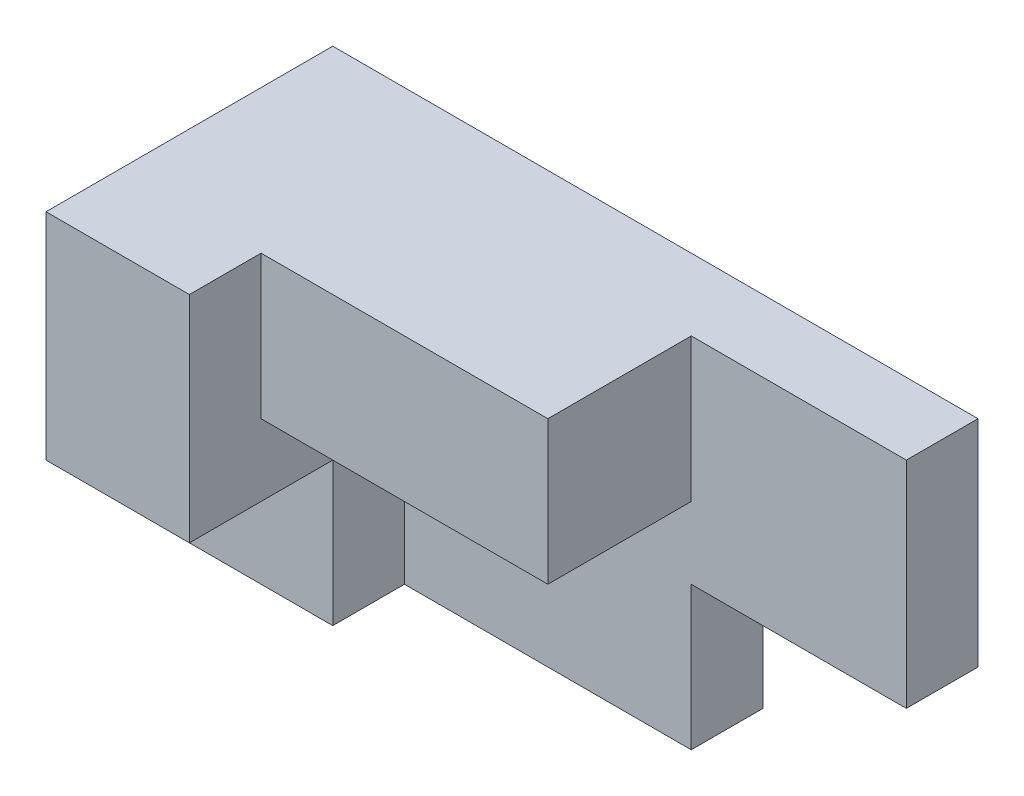
ISO-10303-21;
HEADER;
FILE_DESCRIPTION(('STEP AP214'),'2;1');
FILE_NAME('part.step','',(''),(''),'','','');
FILE_SCHEMA(('AUTOMOTIVE_DESIGN { 1 0 10303 214 1 1 1 1 }'));
ENDSEC;
DATA;
#1=APPLICATION_CONTEXT('core data for automotive mechanical design processes');
#2=APPLICATION_PROTOCOL_DEFINITION('international standard','automotive_design',2000,#1);
#3=PRODUCT_CONTEXT('',#1,'mechanical');
#4=PRODUCT('Part','Part','',(#3));
#5=PRODUCT_RELATED_PRODUCT_CATEGORY('part','',(#4));
#6=PRODUCT_DEFINITION_FORMATION('','',#4);
#7=PRODUCT_DEFINITION_CONTEXT('part definition',#1,'design');
#8=PRODUCT_DEFINITION('design','',#6,#7);
#9=PRODUCT_DEFINITION_SHAPE('','',#8);
#10=(LENGTH_UNIT() NAMED_UNIT(*) SI_UNIT(.MILLI.,.METRE.));
#11=(NAMED_UNIT(*) PLANE_ANGLE_UNIT() SI_UNIT($,.RADIAN.));
#12=(NAMED_UNIT(*) SI_UNIT($,.STERADIAN.) SOLID_ANGLE_UNIT());
#13=UNCERTAINTY_MEASURE_WITH_UNIT(LENGTH_MEASURE(1.E-05),#10,'distance_accuracy_value','');
#14=(GEOMETRIC_REPRESENTATION_CONTEXT(3) GLOBAL_UNCERTAINTY_ASSIGNED_CONTEXT((#13)) GLOBAL_UNIT_ASSIGNED_CONTEXT((#10,
#11,#12)) REPRESENTATION_CONTEXT('',''));
#15=CARTESIAN_POINT('',(0.,0.,0.));
#16=DIRECTION('',(0.,0.,1.));
#17=DIRECTION('',(1.,0.,0.));
#18=AXIS2_PLACEMENT_3D('',#15,#16,#17);
#19=CARTESIAN_POINT('',(0.,0.,10.));
#20=DIRECTION('',(0.,0.,1.));
#21=DIRECTION('',(1.,0.,0.));
#22=AXIS2_PLACEMENT_3D('',#19,#20,#21);
#23=PLANE('',#22);
#24=DIRECTION('',(-1.,0.,0.));
#25=VECTOR('',#24,1.);
#26=CARTESIAN_POINT('',(0.,30.,10.));
#27=LINE('',#26,#25);
#28=CARTESIAN_POINT('',(60.,30.,10.));
#29=VERTEX_POINT('',#28);
#30=CARTESIAN_POINT('',(20.,30.,10.));
#31=VERTEX_POINT('',#30);
#32=EDGE_CURVE('E195',#29,#31,#27,.T.);
#33=ORIENTED_EDGE('',*,*,#32,.T.);
#34=DIRECTION('',(0.,-1.,0.));
#35=VECTOR('',#34,1.);
#36=CARTESIAN_POINT('',(20.,0.,10.));
#37=LINE('',#36,#35);
#38=CARTESIAN_POINT('',(20.,0.,10.));
#39=VERTEX_POINT('',#38);
#40=EDGE_CURVE('E208',#31,#39,#37,.T.);
#41=ORIENTED_EDGE('',*,*,#40,.T.);
#42=DIRECTION('',(1.,0.,0.));
#43=VECTOR('',#42,1.);
#44=CARTESIAN_POINT('',(0.,0.,10.));
#45=LINE('',#44,#43);
#46=CARTESIAN_POINT('',(60.,0.,10.));
#47=VERTEX_POINT('',#46);
#48=EDGE_CURVE('E95',#39,#47,#45,.T.);
#49=ORIENTED_EDGE('',*,*,#48,.T.);
#50=DIRECTION('',(0.,1.,0.));
#51=VECTOR('',#50,1.);
#52=CARTESIAN_POINT('',(60.,0.,10.));
#53=LINE('',#52,#51);
#54=CARTESIAN_POINT('',(60.,20.,10.));
#55=VERTEX_POINT('',#54);
#56=EDGE_CURVE('E213',#47,#55,#53,.T.);
#57=ORIENTED_EDGE('',*,*,#56,.T.);
#58=DIRECTION('',(1.,0.,0.));
#59=VECTOR('',#58,1.);
#60=CARTESIAN_POINT('',(0.,20.,10.));
#61=LINE('',#60,#59);
#62=CARTESIAN_POINT('',(90.,20.,10.));
#63=VERTEX_POINT('',#62);
#64=EDGE_CURVE('E215',#55,#63,#61,.T.);
#65=ORIENTED_EDGE('',*,*,#64,.T.);
#66=DIRECTION('',(0.,-1.,0.));
#67=VECTOR('',#66,1.);
#68=CARTESIAN_POINT('',(90.,0.,10.));
#69=LINE('',#68,#67);
#70=CARTESIAN_POINT('',(90.,50.,10.));
#71=VERTEX_POINT('',#70);
#72=EDGE_CURVE('E217',#71,#63,#69,.T.);
#73=ORIENTED_EDGE('',*,*,#72,.F.);
#74=DIRECTION('',(1.,0.,0.));
#75=VECTOR('',#74,1.);
#76=CARTESIAN_POINT('',(0.,50.,10.));
#77=LINE('',#76,#75);
#78=CARTESIAN_POINT('',(60.,50.,10.));
#79=VERTEX_POINT('',#78);
#80=EDGE_CURVE('E60',#79,#71,#77,.T.);
#81=ORIENTED_EDGE('',*,*,#80,.F.);
#82=DIRECTION('',(0.,-1.,0.));
#83=VECTOR('',#82,1.);
#84=CARTESIAN_POINT('',(60.,0.,10.));
#85=LINE('',#84,#83);
#86=EDGE_CURVE('E192',#79,#29,#85,.T.);
#87=ORIENTED_EDGE('',*,*,#86,.T.);
#88=EDGE_LOOP('',(#33,#41,#49,#57,#65,#73,#81,#87));
#89=FACE_BOUND('',#88,.T.);
#90=ADVANCED_FACE('F39',(#89),#23,.T.);
#91=CARTESIAN_POINT('',(0.,50.,10.));
#92=DIRECTION('',(0.,1.,0.));
#93=DIRECTION('',(-1.,0.,0.));
#94=AXIS2_PLACEMENT_3D('',#91,#92,#93);
#95=PLANE('',#94);
#96=DIRECTION('',(0.,0.,-1.));
#97=VECTOR('',#96,1.);
#98=CARTESIAN_POINT('',(0.,50.,10.));
#99=LINE('',#98,#97);
#100=CARTESIAN_POINT('',(0.,50.,40.));
#101=VERTEX_POINT('',#100);
#102=CARTESIAN_POINT('',(0.,50.,0.));
#103=VERTEX_POINT('',#102);
#104=EDGE_CURVE('E11',#101,#103,#99,.T.);
#105=ORIENTED_EDGE('',*,*,#104,.F.);
#106=DIRECTION('',(1.,0.,0.));
#107=VECTOR('',#106,1.);
#108=CARTESIAN_POINT('',(0.,50.,40.));
#109=LINE('',#108,#107);
#110=CARTESIAN_POINT('',(20.,50.,40.));
#111=VERTEX_POINT('',#110);
#112=EDGE_CURVE('E168',#101,#111,#109,.T.);
#113=ORIENTED_EDGE('',*,*,#112,.T.);
#114=DIRECTION('',(0.,0.,-1.));
#115=VECTOR('',#114,1.);
#116=CARTESIAN_POINT('',(20.,50.,40.));
#117=LINE('',#116,#115);
#118=CARTESIAN_POINT('',(20.,50.,30.));
#119=VERTEX_POINT('',#118);
#120=EDGE_CURVE('E173',#111,#119,#117,.T.);
#121=ORIENTED_EDGE('',*,*,#120,.T.);
#122=DIRECTION('',(1.,0.,0.));
#123=VECTOR('',#122,1.);
#124=CARTESIAN_POINT('',(0.,50.,30.));
#125=LINE('',#124,#123);
#126=CARTESIAN_POINT('',(60.,50.,30.));
#127=VERTEX_POINT('',#126);
#128=EDGE_CURVE('E183',#119,#127,#125,.T.);
#129=ORIENTED_EDGE('',*,*,#128,.T.);
#130=DIRECTION('',(0.,0.,-1.));
#131=VECTOR('',#130,1.);
#132=CARTESIAN_POINT('',(60.,50.,30.));
#133=LINE('',#132,#131);
#134=EDGE_CURVE('E54',#127,#79,#133,.T.);
#135=ORIENTED_EDGE('',*,*,#134,.T.);
#136=ORIENTED_EDGE('',*,*,#80,.T.);
#137=DIRECTION('',(0.,0.,-1.));
#138=VECTOR('',#137,1.);
#139=CARTESIAN_POINT('',(90.,50.,10.));
#140=LINE('',#139,#138);
#141=CARTESIAN_POINT('',(90.,50.,0.));
#142=VERTEX_POINT('',#141);
#143=EDGE_CURVE('E220',#71,#142,#140,.T.);
#144=ORIENTED_EDGE('',*,*,#143,.T.);
#145=DIRECTION('',(1.,0.,0.));
#146=VECTOR('',#145,1.);
#147=CARTESIAN_POINT('',(0.,50.,0.));
#148=LINE('',#147,#146);
#149=EDGE_CURVE('E88',#103,#142,#148,.T.);
#150=ORIENTED_EDGE('',*,*,#149,.F.);
#151=EDGE_LOOP('',(#105,#113,#121,#129,#135,#136,#144,#150));
#152=FACE_BOUND('',#151,.T.);
#153=ADVANCED_FACE('F41',(#152),#95,.T.);
#154=CARTESIAN_POINT('',(0.,0.,10.));
#155=DIRECTION('',(-1.,0.,0.));
#156=DIRECTION('',(0.,0.,1.));
#157=AXIS2_PLACEMENT_3D('',#154,#155,#156);
#158=PLANE('',#157);
#159=DIRECTION('',(0.,1.,0.));
#160=VECTOR('',#159,1.);
#161=CARTESIAN_POINT('',(0.,0.,40.));
#162=LINE('',#161,#160);
#163=CARTESIAN_POINT('',(0.,20.,40.));
#164=VERTEX_POINT('',#163);
#165=EDGE_CURVE('E149',#164,#101,#162,.T.);
#166=ORIENTED_EDGE('',*,*,#165,.T.);
#167=ORIENTED_EDGE('',*,*,#104,.T.);
#168=DIRECTION('',(0.,1.,0.));
#169=VECTOR('',#168,1.);
#170=CARTESIAN_POINT('',(0.,0.,0.));
#171=LINE('',#170,#169);
#172=CARTESIAN_POINT('',(0.,0.,0.));
#173=VERTEX_POINT('',#172);
#174=EDGE_CURVE('E222',#173,#103,#171,.T.);
#175=ORIENTED_EDGE('',*,*,#174,.F.);
#176=DIRECTION('',(0.,0.,-1.));
#177=VECTOR('',#176,1.);
#178=CARTESIAN_POINT('',(0.,0.,10.));
#179=LINE('',#178,#177);
#180=CARTESIAN_POINT('',(0.,0.,20.));
#181=VERTEX_POINT('',#180);
#182=EDGE_CURVE('E47',#181,#173,#179,.T.);
#183=ORIENTED_EDGE('',*,*,#182,.F.);
#184=DIRECTION('',(0.,1.,0.));
#185=VECTOR('',#184,1.);
#186=CARTESIAN_POINT('',(0.,0.,20.));
#187=LINE('',#186,#185);
#188=CARTESIAN_POINT('',(0.,20.,20.));
#189=VERTEX_POINT('',#188);
#190=EDGE_CURVE('E152',#181,#189,#187,.T.);
#191=ORIENTED_EDGE('',*,*,#190,.T.);
#192=DIRECTION('',(0.,0.,-1.));
#193=VECTOR('',#192,1.);
#194=CARTESIAN_POINT('',(0.,20.,40.));
#195=LINE('',#194,#193);
#196=EDGE_CURVE('E145',#164,#189,#195,.T.);
#197=ORIENTED_EDGE('',*,*,#196,.F.);
#198=EDGE_LOOP('',(#166,#167,#175,#183,#191,#197));
#199=FACE_BOUND('',#198,.T.);
#200=ADVANCED_FACE('F147',(#199),#158,.T.);
#201=CARTESIAN_POINT('',(0.,0.,10.));
#202=DIRECTION('',(0.,1.,0.));
#203=DIRECTION('',(0.,0.,1.));
#204=AXIS2_PLACEMENT_3D('',#201,#202,#203);
#205=PLANE('',#204);
#206=DIRECTION('',(1.,0.,0.));
#207=VECTOR('',#206,1.);
#208=CARTESIAN_POINT('',(0.,0.,0.));
#209=LINE('',#208,#207);
#210=CARTESIAN_POINT('',(60.,0.,0.));
#211=VERTEX_POINT('',#210);
#212=EDGE_CURVE('E224',#173,#211,#209,.T.);
#213=ORIENTED_EDGE('',*,*,#212,.T.);
#214=DIRECTION('',(0.,0.,-1.));
#215=VECTOR('',#214,1.);
#216=CARTESIAN_POINT('',(60.,0.,10.));
#217=LINE('',#216,#215);
#218=EDGE_CURVE('E238',#47,#211,#217,.T.);
#219=ORIENTED_EDGE('',*,*,#218,.F.);
#220=ORIENTED_EDGE('',*,*,#48,.F.);
#221=DIRECTION('',(0.,0.,-1.));
#222=VECTOR('',#221,1.);
#223=CARTESIAN_POINT('',(20.,0.,20.));
#224=LINE('',#223,#222);
#225=CARTESIAN_POINT('',(20.,0.,20.));
#226=VERTEX_POINT('',#225);
#227=EDGE_CURVE('E206',#226,#39,#224,.T.);
#228=ORIENTED_EDGE('',*,*,#227,.F.);
#229=DIRECTION('',(1.,0.,0.));
#230=VECTOR('',#229,1.);
#231=CARTESIAN_POINT('',(0.,0.,20.));
#232=LINE('',#231,#230);
#233=EDGE_CURVE('E198',#181,#226,#232,.T.);
#234=ORIENTED_EDGE('',*,*,#233,.F.);
#235=ORIENTED_EDGE('',*,*,#182,.T.);
#236=EDGE_LOOP('',(#213,#219,#220,#228,#234,#235));
#237=FACE_BOUND('',#236,.T.);
#238=ADVANCED_FACE('F243',(#237),#205,.F.);
#239=CARTESIAN_POINT('',(60.,0.,10.));
#240=DIRECTION('',(-1.,0.,0.));
#241=DIRECTION('',(0.,0.,1.));
#242=AXIS2_PLACEMENT_3D('',#239,#240,#241);
#243=PLANE('',#242);
#244=DIRECTION('',(0.,1.,0.));
#245=VECTOR('',#244,1.);
#246=CARTESIAN_POINT('',(60.,0.,0.));
#247=LINE('',#246,#245);
#248=CARTESIAN_POINT('',(60.,20.,0.));
#249=VERTEX_POINT('',#248);
#250=EDGE_CURVE('E226',#211,#249,#247,.T.);
#251=ORIENTED_EDGE('',*,*,#250,.T.);
#252=DIRECTION('',(0.,0.,-1.));
#253=VECTOR('',#252,1.);
#254=CARTESIAN_POINT('',(60.,20.,10.));
#255=LINE('',#254,#253);
#256=EDGE_CURVE('E235',#55,#249,#255,.T.);
#257=ORIENTED_EDGE('',*,*,#256,.F.);
#258=ORIENTED_EDGE('',*,*,#56,.F.);
#259=ORIENTED_EDGE('',*,*,#218,.T.);
#260=EDGE_LOOP('',(#251,#257,#258,#259));
#261=FACE_BOUND('',#260,.T.);
#262=ADVANCED_FACE('F260',(#261),#243,.F.);
#263=CARTESIAN_POINT('',(0.,20.,10.));
#264=DIRECTION('',(0.,1.,0.));
#265=DIRECTION('',(0.,0.,1.));
#266=AXIS2_PLACEMENT_3D('',#263,#264,#265);
#267=PLANE('',#266);
#268=DIRECTION('',(1.,0.,0.));
#269=VECTOR('',#268,1.);
#270=CARTESIAN_POINT('',(0.,20.,0.));
#271=LINE('',#270,#269);
#272=CARTESIAN_POINT('',(90.,20.,0.));
#273=VERTEX_POINT('',#272);
#274=EDGE_CURVE('E228',#249,#273,#271,.T.);
#275=ORIENTED_EDGE('',*,*,#274,.T.);
#276=DIRECTION('',(0.,0.,-1.));
#277=VECTOR('',#276,1.);
#278=CARTESIAN_POINT('',(90.,20.,10.));
#279=LINE('',#278,#277);
#280=EDGE_CURVE('E233',#63,#273,#279,.T.);
#281=ORIENTED_EDGE('',*,*,#280,.F.);
#282=ORIENTED_EDGE('',*,*,#64,.F.);
#283=ORIENTED_EDGE('',*,*,#256,.T.);
#284=EDGE_LOOP('',(#275,#281,#282,#283));
#285=FACE_BOUND('',#284,.T.);
#286=ADVANCED_FACE('F255',(#285),#267,.F.);
#287=CARTESIAN_POINT('',(90.,0.,10.));
#288=DIRECTION('',(1.,0.,0.));
#289=DIRECTION('',(0.,0.,-1.));
#290=AXIS2_PLACEMENT_3D('',#287,#288,#289);
#291=PLANE('',#290);
#292=DIRECTION('',(0.,-1.,0.));
#293=VECTOR('',#292,1.);
#294=CARTESIAN_POINT('',(90.,0.,0.));
#295=LINE('',#294,#293);
#296=EDGE_CURVE('E211',#142,#273,#295,.T.);
#297=ORIENTED_EDGE('',*,*,#296,.F.);
#298=ORIENTED_EDGE('',*,*,#143,.F.);
#299=ORIENTED_EDGE('',*,*,#72,.T.);
#300=ORIENTED_EDGE('',*,*,#280,.T.);
#301=EDGE_LOOP('',(#297,#298,#299,#300));
#302=FACE_BOUND('',#301,.T.);
#303=ADVANCED_FACE('F252',(#302),#291,.T.);
#304=CARTESIAN_POINT('',(0.,0.,0.));
#305=DIRECTION('',(0.,0.,1.));
#306=DIRECTION('',(1.,0.,0.));
#307=AXIS2_PLACEMENT_3D('',#304,#305,#306);
#308=PLANE('',#307);
#309=ORIENTED_EDGE('',*,*,#174,.T.);
#310=ORIENTED_EDGE('',*,*,#149,.T.);
#311=ORIENTED_EDGE('',*,*,#296,.T.);
#312=ORIENTED_EDGE('',*,*,#274,.F.);
#313=ORIENTED_EDGE('',*,*,#250,.F.);
#314=ORIENTED_EDGE('',*,*,#212,.F.);
#315=EDGE_LOOP('',(#309,#310,#311,#312,#313,#314));
#316=FACE_BOUND('',#315,.T.);
#317=ADVANCED_FACE('F247',(#316),#308,.F.);
#318=CARTESIAN_POINT('',(20.,0.,20.));
#319=DIRECTION('',(-1.,0.,0.));
#320=DIRECTION('',(0.,-1.,0.));
#321=AXIS2_PLACEMENT_3D('',#318,#319,#320);
#322=PLANE('',#321);
#323=ORIENTED_EDGE('',*,*,#40,.F.);
#324=DIRECTION('',(0.,0.,-1.));
#325=VECTOR('',#324,1.);
#326=CARTESIAN_POINT('',(20.,30.,30.));
#327=LINE('',#326,#325);
#328=CARTESIAN_POINT('',(20.,30.,30.));
#329=VERTEX_POINT('',#328);
#330=EDGE_CURVE('E189',#329,#31,#327,.T.);
#331=ORIENTED_EDGE('',*,*,#330,.F.);
#332=DIRECTION('',(0.,1.,0.));
#333=VECTOR('',#332,1.);
#334=CARTESIAN_POINT('',(20.,0.,30.));
#335=LINE('',#334,#333);
#336=EDGE_CURVE('E155',#329,#119,#335,.T.);
#337=ORIENTED_EDGE('',*,*,#336,.T.);
#338=ORIENTED_EDGE('',*,*,#120,.F.);
#339=DIRECTION('',(0.,1.,0.));
#340=VECTOR('',#339,1.);
#341=CARTESIAN_POINT('',(20.,0.,40.));
#342=LINE('',#341,#340);
#343=CARTESIAN_POINT('',(20.,20.,40.));
#344=VERTEX_POINT('',#343);
#345=EDGE_CURVE('E164',#344,#111,#342,.T.);
#346=ORIENTED_EDGE('',*,*,#345,.F.);
#347=DIRECTION('',(0.,0.,-1.));
#348=VECTOR('',#347,1.);
#349=CARTESIAN_POINT('',(20.,20.,40.));
#350=LINE('',#349,#348);
#351=CARTESIAN_POINT('',(20.,20.,20.));
#352=VERTEX_POINT('',#351);
#353=EDGE_CURVE('E156',#344,#352,#350,.T.);
#354=ORIENTED_EDGE('',*,*,#353,.T.);
#355=DIRECTION('',(0.,1.,0.));
#356=VECTOR('',#355,1.);
#357=CARTESIAN_POINT('',(20.,0.,20.));
#358=LINE('',#357,#356);
#359=EDGE_CURVE('E201',#226,#352,#358,.T.);
#360=ORIENTED_EDGE('',*,*,#359,.F.);
#361=ORIENTED_EDGE('',*,*,#227,.T.);
#362=EDGE_LOOP('',(#323,#331,#337,#338,#346,#354,#360,#361));
#363=FACE_BOUND('',#362,.T.);
#364=ADVANCED_FACE('F262',(#363),#322,.F.);
#365=CARTESIAN_POINT('',(0.,0.,20.));
#366=DIRECTION('',(0.,0.,1.));
#367=DIRECTION('',(1.,0.,0.));
#368=AXIS2_PLACEMENT_3D('',#365,#366,#367);
#369=PLANE('',#368);
#370=ORIENTED_EDGE('',*,*,#233,.T.);
#371=ORIENTED_EDGE('',*,*,#359,.T.);
#372=DIRECTION('',(1.,0.,0.));
#373=VECTOR('',#372,1.);
#374=CARTESIAN_POINT('',(0.,20.,20.));
#375=LINE('',#374,#373);
#376=EDGE_CURVE('E203',#189,#352,#375,.T.);
#377=ORIENTED_EDGE('',*,*,#376,.F.);
#378=ORIENTED_EDGE('',*,*,#190,.F.);
#379=EDGE_LOOP('',(#370,#371,#377,#378));
#380=FACE_BOUND('',#379,.T.);
#381=ADVANCED_FACE('F331',(#380),#369,.T.);
#382=CARTESIAN_POINT('',(0.,30.,30.));
#383=DIRECTION('',(0.,1.,0.));
#384=DIRECTION('',(0.,0.,1.));
#385=AXIS2_PLACEMENT_3D('',#382,#383,#384);
#386=PLANE('',#385);
#387=ORIENTED_EDGE('',*,*,#32,.F.);
#388=DIRECTION('',(0.,0.,-1.));
#389=VECTOR('',#388,1.);
#390=CARTESIAN_POINT('',(60.,30.,30.));
#391=LINE('',#390,#389);
#392=CARTESIAN_POINT('',(60.,30.,30.));
#393=VERTEX_POINT('',#392);
#394=EDGE_CURVE('E186',#393,#29,#391,.T.);
#395=ORIENTED_EDGE('',*,*,#394,.F.);
#396=DIRECTION('',(1.,0.,0.));
#397=VECTOR('',#396,1.);
#398=CARTESIAN_POINT('',(0.,30.,30.));
#399=LINE('',#398,#397);
#400=EDGE_CURVE('E179',#329,#393,#399,.T.);
#401=ORIENTED_EDGE('',*,*,#400,.F.);
#402=ORIENTED_EDGE('',*,*,#330,.T.);
#403=EDGE_LOOP('',(#387,#395,#401,#402));
#404=FACE_BOUND('',#403,.T.);
#405=ADVANCED_FACE('F266',(#404),#386,.F.);
#406=CARTESIAN_POINT('',(60.,0.,30.));
#407=DIRECTION('',(-1.,0.,0.));
#408=DIRECTION('',(0.,0.,1.));
#409=AXIS2_PLACEMENT_3D('',#406,#407,#408);
#410=PLANE('',#409);
#411=ORIENTED_EDGE('',*,*,#86,.F.);
#412=ORIENTED_EDGE('',*,*,#134,.F.);
#413=DIRECTION('',(0.,1.,0.));
#414=VECTOR('',#413,1.);
#415=CARTESIAN_POINT('',(60.,0.,30.));
#416=LINE('',#415,#414);
#417=EDGE_CURVE('E181',#393,#127,#416,.T.);
#418=ORIENTED_EDGE('',*,*,#417,.F.);
#419=ORIENTED_EDGE('',*,*,#394,.T.);
#420=EDGE_LOOP('',(#411,#412,#418,#419));
#421=FACE_BOUND('',#420,.T.);
#422=ADVANCED_FACE('F269',(#421),#410,.F.);
#423=CARTESIAN_POINT('',(0.,0.,30.));
#424=DIRECTION('',(0.,0.,1.));
#425=DIRECTION('',(1.,0.,0.));
#426=AXIS2_PLACEMENT_3D('',#423,#424,#425);
#427=PLANE('',#426);
#428=ORIENTED_EDGE('',*,*,#336,.F.);
#429=ORIENTED_EDGE('',*,*,#400,.T.);
#430=ORIENTED_EDGE('',*,*,#417,.T.);
#431=ORIENTED_EDGE('',*,*,#128,.F.);
#432=EDGE_LOOP('',(#428,#429,#430,#431));
#433=FACE_BOUND('',#432,.T.);
#434=ADVANCED_FACE('F272',(#433),#427,.T.);
#435=CARTESIAN_POINT('',(0.,20.,40.));
#436=DIRECTION('',(0.,1.,0.));
#437=DIRECTION('',(0.,0.,1.));
#438=AXIS2_PLACEMENT_3D('',#435,#436,#437);
#439=PLANE('',#438);
#440=ORIENTED_EDGE('',*,*,#376,.T.);
#441=ORIENTED_EDGE('',*,*,#353,.F.);
#442=DIRECTION('',(1.,0.,0.));
#443=VECTOR('',#442,1.);
#444=CARTESIAN_POINT('',(0.,20.,40.));
#445=LINE('',#444,#443);
#446=EDGE_CURVE('E159',#164,#344,#445,.T.);
#447=ORIENTED_EDGE('',*,*,#446,.F.);
#448=ORIENTED_EDGE('',*,*,#196,.T.);
#449=EDGE_LOOP('',(#440,#441,#447,#448));
#450=FACE_BOUND('',#449,.T.);
#451=ADVANCED_FACE('F160',(#450),#439,.F.);
#452=CARTESIAN_POINT('',(0.,0.,40.));
#453=DIRECTION('',(0.,0.,1.));
#454=DIRECTION('',(1.,0.,0.));
#455=AXIS2_PLACEMENT_3D('',#452,#453,#454);
#456=PLANE('',#455);
#457=ORIENTED_EDGE('',*,*,#165,.F.);
#458=ORIENTED_EDGE('',*,*,#446,.T.);
#459=ORIENTED_EDGE('',*,*,#345,.T.);
#460=ORIENTED_EDGE('',*,*,#112,.F.);
#461=EDGE_LOOP('',(#457,#458,#459,#460));
#462=FACE_BOUND('',#461,.T.);
#463=ADVANCED_FACE('F166',(#462),#456,.T.);
#464=CLOSED_SHELL('',(#90,#153,#200,#238,#262,#286,#303,#317,#364,#381,#405,#422,#434,#451,#463));
#465=MANIFOLD_SOLID_BREP('B2',#464);
#466=ADVANCED_BREP_SHAPE_REPRESENTATION('',(#18,#465),#14);
#467=SHAPE_DEFINITION_REPRESENTATION(#9,#466);
ENDSEC;
END-ISO-10303-21;
